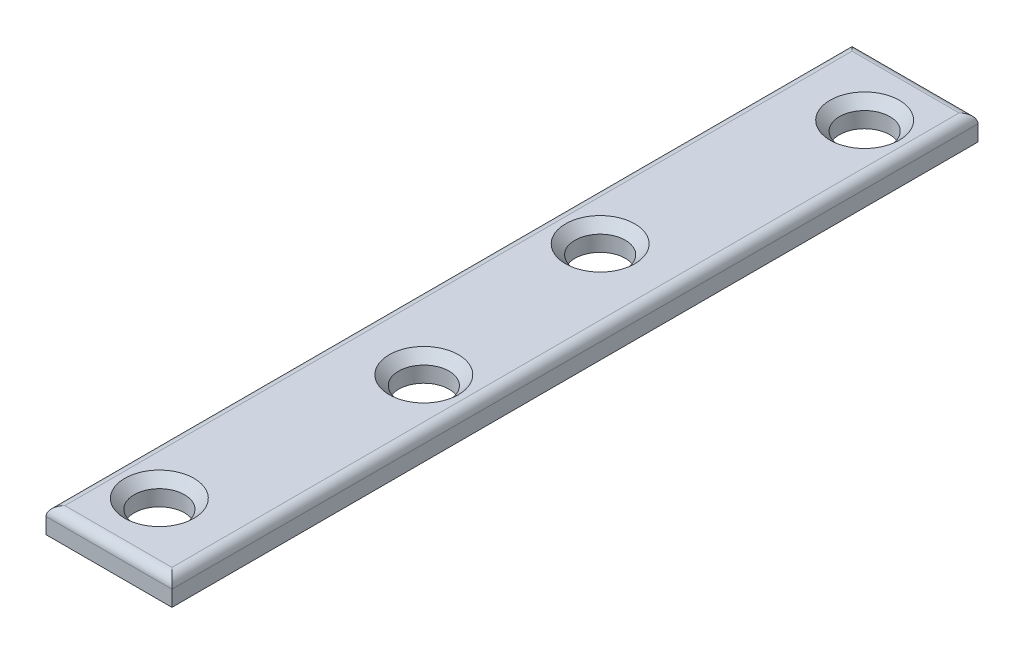
ISO-10303-21;
HEADER;
FILE_DESCRIPTION(('STEP AP214'),'2;1');
FILE_NAME('part.step','',(''),(''),'','','');
FILE_SCHEMA(('AUTOMOTIVE_DESIGN { 1 0 10303 214 1 1 1 1 }'));
ENDSEC;
DATA;
#1=APPLICATION_CONTEXT('core data for automotive mechanical design processes');
#2=APPLICATION_PROTOCOL_DEFINITION('international standard','automotive_design',2000,#1);
#3=PRODUCT_CONTEXT('',#1,'mechanical');
#4=PRODUCT('Part','Part','',(#3));
#5=PRODUCT_RELATED_PRODUCT_CATEGORY('part','',(#4));
#6=PRODUCT_DEFINITION_FORMATION('','',#4);
#7=PRODUCT_DEFINITION_CONTEXT('part definition',#1,'design');
#8=PRODUCT_DEFINITION('design','',#6,#7);
#9=PRODUCT_DEFINITION_SHAPE('','',#8);
#10=(LENGTH_UNIT() NAMED_UNIT(*) SI_UNIT(.MILLI.,.METRE.));
#11=(NAMED_UNIT(*) PLANE_ANGLE_UNIT() SI_UNIT($,.RADIAN.));
#12=(NAMED_UNIT(*) SI_UNIT($,.STERADIAN.) SOLID_ANGLE_UNIT());
#13=UNCERTAINTY_MEASURE_WITH_UNIT(LENGTH_MEASURE(1.E-05),#10,'distance_accuracy_value','');
#14=(GEOMETRIC_REPRESENTATION_CONTEXT(3) GLOBAL_UNCERTAINTY_ASSIGNED_CONTEXT((#13)) GLOBAL_UNIT_ASSIGNED_CONTEXT((#10,
#11,#12)) REPRESENTATION_CONTEXT('',''));
#15=CARTESIAN_POINT('',(0.,0.,0.));
#16=DIRECTION('',(0.,0.,1.));
#17=DIRECTION('',(1.,0.,0.));
#18=AXIS2_PLACEMENT_3D('',#15,#16,#17);
#19=CARTESIAN_POINT('',(0.,3.175,0.));
#20=DIRECTION('',(1.,0.,0.));
#21=DIRECTION('',(0.,0.,-1.));
#22=AXIS2_PLACEMENT_3D('',#19,#20,#21);
#23=PLANE('',#22);
#24=DIRECTION('',(0.,-1.,0.));
#25=VECTOR('',#24,1.);
#26=CARTESIAN_POINT('',(0.,3.175,0.));
#27=LINE('',#26,#25);
#28=CARTESIAN_POINT('',(0.,1.984375,0.));
#29=VERTEX_POINT('',#28);
#30=CARTESIAN_POINT('',(0.,0.,0.));
#31=VERTEX_POINT('',#30);
#32=EDGE_CURVE('E87',#29,#31,#27,.T.);
#33=ORIENTED_EDGE('',*,*,#32,.F.);
#34=DIRECTION('',(0.,0.,1.));
#35=VECTOR('',#34,1.);
#36=CARTESIAN_POINT('',(0.,1.984375,0.));
#37=LINE('',#36,#35);
#38=CARTESIAN_POINT('',(0.,1.984375,-101.6));
#39=VERTEX_POINT('',#38);
#40=EDGE_CURVE('E11',#29,#39,#37,.F.);
#41=ORIENTED_EDGE('',*,*,#40,.T.);
#42=DIRECTION('',(0.,-1.,0.));
#43=VECTOR('',#42,1.);
#44=CARTESIAN_POINT('',(0.,3.175,-101.6));
#45=LINE('',#44,#43);
#46=CARTESIAN_POINT('',(0.,0.,-101.6));
#47=VERTEX_POINT('',#46);
#48=EDGE_CURVE('E107',#39,#47,#45,.T.);
#49=ORIENTED_EDGE('',*,*,#48,.T.);
#50=DIRECTION('',(0.,0.,1.));
#51=VECTOR('',#50,1.);
#52=CARTESIAN_POINT('',(0.,0.,0.));
#53=LINE('',#52,#51);
#54=EDGE_CURVE('E102',#47,#31,#53,.T.);
#55=ORIENTED_EDGE('',*,*,#54,.T.);
#56=EDGE_LOOP('',(#33,#41,#49,#55));
#57=FACE_BOUND('',#56,.T.);
#58=ADVANCED_FACE('F35',(#57),#23,.F.);
#59=CARTESIAN_POINT('',(0.,3.175,0.));
#60=DIRECTION('',(0.,0.,-1.));
#61=DIRECTION('',(-1.,0.,0.));
#62=AXIS2_PLACEMENT_3D('',#59,#60,#61);
#63=PLANE('',#62);
#64=DIRECTION('',(0.,-1.,0.));
#65=VECTOR('',#64,1.);
#66=CARTESIAN_POINT('',(15.875,3.175,0.));
#67=LINE('',#66,#65);
#68=CARTESIAN_POINT('',(15.875,1.984375,0.));
#69=VERTEX_POINT('',#68);
#70=CARTESIAN_POINT('',(15.875,0.,0.));
#71=VERTEX_POINT('',#70);
#72=EDGE_CURVE('E96',#69,#71,#67,.T.);
#73=ORIENTED_EDGE('',*,*,#72,.F.);
#74=DIRECTION('',(1.,0.,0.));
#75=VECTOR('',#74,1.);
#76=CARTESIAN_POINT('',(0.,1.984375,0.));
#77=LINE('',#76,#75);
#78=EDGE_CURVE('E44',#69,#29,#77,.F.);
#79=ORIENTED_EDGE('',*,*,#78,.T.);
#80=ORIENTED_EDGE('',*,*,#32,.T.);
#81=DIRECTION('',(1.,0.,0.));
#82=VECTOR('',#81,1.);
#83=CARTESIAN_POINT('',(0.,0.,0.));
#84=LINE('',#83,#82);
#85=EDGE_CURVE('E90',#31,#71,#84,.T.);
#86=ORIENTED_EDGE('',*,*,#85,.T.);
#87=EDGE_LOOP('',(#73,#79,#80,#86));
#88=FACE_BOUND('',#87,.T.);
#89=ADVANCED_FACE('F89',(#88),#63,.F.);
#90=CARTESIAN_POINT('',(15.875,3.175,0.));
#91=DIRECTION('',(-1.,0.,0.));
#92=DIRECTION('',(0.,0.,1.));
#93=AXIS2_PLACEMENT_3D('',#90,#91,#92);
#94=PLANE('',#93);
#95=DIRECTION('',(0.,-1.,0.));
#96=VECTOR('',#95,1.);
#97=CARTESIAN_POINT('',(15.875,3.175,-101.6));
#98=LINE('',#97,#96);
#99=CARTESIAN_POINT('',(15.875,1.984375,-101.6));
#100=VERTEX_POINT('',#99);
#101=CARTESIAN_POINT('',(15.875,0.,-101.6));
#102=VERTEX_POINT('',#101);
#103=EDGE_CURVE('E120',#100,#102,#98,.T.);
#104=ORIENTED_EDGE('',*,*,#103,.F.);
#105=DIRECTION('',(0.,0.,-1.));
#106=VECTOR('',#105,1.);
#107=CARTESIAN_POINT('',(15.875,1.984375,0.));
#108=LINE('',#107,#106);
#109=EDGE_CURVE('E59',#100,#69,#108,.F.);
#110=ORIENTED_EDGE('',*,*,#109,.T.);
#111=ORIENTED_EDGE('',*,*,#72,.T.);
#112=DIRECTION('',(0.,0.,-1.));
#113=VECTOR('',#112,1.);
#114=CARTESIAN_POINT('',(15.875,0.,0.));
#115=LINE('',#114,#113);
#116=EDGE_CURVE('E104',#71,#102,#115,.T.);
#117=ORIENTED_EDGE('',*,*,#116,.T.);
#118=EDGE_LOOP('',(#104,#110,#111,#117));
#119=FACE_BOUND('',#118,.T.);
#120=ADVANCED_FACE('F205',(#119),#94,.F.);
#121=CARTESIAN_POINT('',(0.,3.175,-101.6));
#122=DIRECTION('',(0.,0.,1.));
#123=DIRECTION('',(1.,0.,0.));
#124=AXIS2_PLACEMENT_3D('',#121,#122,#123);
#125=PLANE('',#124);
#126=ORIENTED_EDGE('',*,*,#48,.F.);
#127=DIRECTION('',(-1.,0.,0.));
#128=VECTOR('',#127,1.);
#129=CARTESIAN_POINT('',(0.,1.984375,-101.6));
#130=LINE('',#129,#128);
#131=EDGE_CURVE('E155',#39,#100,#130,.F.);
#132=ORIENTED_EDGE('',*,*,#131,.T.);
#133=ORIENTED_EDGE('',*,*,#103,.T.);
#134=DIRECTION('',(-1.,0.,0.));
#135=VECTOR('',#134,1.);
#136=CARTESIAN_POINT('',(0.,0.,-101.6));
#137=LINE('',#136,#135);
#138=EDGE_CURVE('E117',#102,#47,#137,.T.);
#139=ORIENTED_EDGE('',*,*,#138,.T.);
#140=EDGE_LOOP('',(#126,#132,#133,#139));
#141=FACE_BOUND('',#140,.T.);
#142=ADVANCED_FACE('F243',(#141),#125,.F.);
#143=CARTESIAN_POINT('',(0.,3.175,0.));
#144=DIRECTION('',(0.,-1.,0.));
#145=DIRECTION('',(0.,0.,-1.));
#146=AXIS2_PLACEMENT_3D('',#143,#144,#145);
#147=PLANE('',#146);
#148=DIRECTION('',(0.,0.,-1.));
#149=VECTOR('',#148,1.);
#150=CARTESIAN_POINT('',(14.684375,3.175,0.));
#151=LINE('',#150,#149);
#152=CARTESIAN_POINT('',(14.684375,3.175,-1.190625));
#153=VERTEX_POINT('',#152);
#154=CARTESIAN_POINT('',(14.684375,3.175,-100.409375));
#155=VERTEX_POINT('',#154);
#156=EDGE_CURVE('E150',#153,#155,#151,.T.);
#157=ORIENTED_EDGE('',*,*,#156,.T.);
#158=DIRECTION('',(-1.,0.,0.));
#159=VECTOR('',#158,1.);
#160=CARTESIAN_POINT('',(0.,3.175,-100.409375));
#161=LINE('',#160,#159);
#162=CARTESIAN_POINT('',(1.190625,3.175,-100.409375));
#163=VERTEX_POINT('',#162);
#164=EDGE_CURVE('E152',#155,#163,#161,.T.);
#165=ORIENTED_EDGE('',*,*,#164,.T.);
#166=DIRECTION('',(0.,0.,1.));
#167=VECTOR('',#166,1.);
#168=CARTESIAN_POINT('',(1.190625,3.175,0.));
#169=LINE('',#168,#167);
#170=CARTESIAN_POINT('',(1.190625,3.175,-1.190625));
#171=VERTEX_POINT('',#170);
#172=EDGE_CURVE('E146',#163,#171,#169,.T.);
#173=ORIENTED_EDGE('',*,*,#172,.T.);
#174=DIRECTION('',(1.,0.,0.));
#175=VECTOR('',#174,1.);
#176=CARTESIAN_POINT('',(0.,3.175,-1.190625));
#177=LINE('',#176,#175);
#178=EDGE_CURVE('E148',#171,#153,#177,.T.);
#179=ORIENTED_EDGE('',*,*,#178,.T.);
#180=EDGE_LOOP('',(#157,#165,#173,#179));
#181=FACE_BOUND('',#180,.T.);
#182=CARTESIAN_POINT('',(6.35,3.175,-7.9375));
#183=DIRECTION('',(0.,-1.,0.));
#184=DIRECTION('',(0.,0.,-1.));
#185=AXIS2_PLACEMENT_3D('',#182,#183,#184);
#186=CIRCLE('',#185,4.365625);
#187=CARTESIAN_POINT('',(6.35,3.175,-12.303125));
#188=VERTEX_POINT('',#187);
#189=EDGE_CURVE('E134',#188,#188,#186,.T.);
#190=ORIENTED_EDGE('',*,*,#189,.T.);
#191=EDGE_LOOP('',(#190));
#192=FACE_BOUND('',#191,.T.);
#193=CARTESIAN_POINT('',(9.525,3.175,-38.1));
#194=DIRECTION('',(0.,-1.,0.));
#195=DIRECTION('',(0.,0.,-1.));
#196=AXIS2_PLACEMENT_3D('',#193,#194,#195);
#197=CIRCLE('',#196,4.365625);
#198=CARTESIAN_POINT('',(9.525,3.175,-42.465625));
#199=VERTEX_POINT('',#198);
#200=EDGE_CURVE('E131',#199,#199,#197,.T.);
#201=ORIENTED_EDGE('',*,*,#200,.T.);
#202=EDGE_LOOP('',(#201));
#203=FACE_BOUND('',#202,.T.);
#204=CARTESIAN_POINT('',(9.525,3.175,-93.6625));
#205=DIRECTION('',(0.,-1.,0.));
#206=DIRECTION('',(0.,0.,-1.));
#207=AXIS2_PLACEMENT_3D('',#204,#205,#206);
#208=CIRCLE('',#207,4.365625);
#209=CARTESIAN_POINT('',(9.525,3.175,-98.028125));
#210=VERTEX_POINT('',#209);
#211=EDGE_CURVE('E128',#210,#210,#208,.T.);
#212=ORIENTED_EDGE('',*,*,#211,.T.);
#213=EDGE_LOOP('',(#212));
#214=FACE_BOUND('',#213,.T.);
#215=CARTESIAN_POINT('',(6.35,3.175,-63.5));
#216=DIRECTION('',(0.,-1.,0.));
#217=DIRECTION('',(0.,0.,-1.));
#218=AXIS2_PLACEMENT_3D('',#215,#216,#217);
#219=CIRCLE('',#218,4.36562499999997);
#220=CARTESIAN_POINT('',(6.35,3.175,-67.865625));
#221=VERTEX_POINT('',#220);
#222=EDGE_CURVE('E125',#221,#221,#219,.T.);
#223=ORIENTED_EDGE('',*,*,#222,.T.);
#224=EDGE_LOOP('',(#223));
#225=FACE_BOUND('',#224,.T.);
#226=ADVANCED_FACE('F247',(#181,#192,#203,#214,#225),#147,.F.);
#227=CARTESIAN_POINT('',(0.,0.,0.));
#228=DIRECTION('',(0.,-1.,0.));
#229=DIRECTION('',(0.,0.,-1.));
#230=AXIS2_PLACEMENT_3D('',#227,#228,#229);
#231=PLANE('',#230);
#232=CARTESIAN_POINT('',(6.35,0.,-7.9375));
#233=DIRECTION('',(0.,1.,0.));
#234=DIRECTION('',(0.,0.,1.));
#235=AXIS2_PLACEMENT_3D('',#232,#233,#234);
#236=CIRCLE('',#235,3.175);
#237=CARTESIAN_POINT('',(6.35,0.,-4.7625));
#238=VERTEX_POINT('',#237);
#239=EDGE_CURVE('E169',#238,#238,#236,.T.);
#240=ORIENTED_EDGE('',*,*,#239,.T.);
#241=EDGE_LOOP('',(#240));
#242=FACE_BOUND('',#241,.T.);
#243=CARTESIAN_POINT('',(9.525,0.,-38.1));
#244=DIRECTION('',(0.,1.,0.));
#245=DIRECTION('',(0.,0.,1.));
#246=AXIS2_PLACEMENT_3D('',#243,#244,#245);
#247=CIRCLE('',#246,3.175);
#248=CARTESIAN_POINT('',(9.525,0.,-34.925));
#249=VERTEX_POINT('',#248);
#250=EDGE_CURVE('E174',#249,#249,#247,.T.);
#251=ORIENTED_EDGE('',*,*,#250,.T.);
#252=EDGE_LOOP('',(#251));
#253=FACE_BOUND('',#252,.T.);
#254=CARTESIAN_POINT('',(9.525,0.,-93.6625));
#255=DIRECTION('',(0.,1.,0.));
#256=DIRECTION('',(0.,0.,1.));
#257=AXIS2_PLACEMENT_3D('',#254,#255,#256);
#258=CIRCLE('',#257,3.175);
#259=CARTESIAN_POINT('',(9.525,0.,-90.4875));
#260=VERTEX_POINT('',#259);
#261=EDGE_CURVE('E112',#260,#260,#258,.T.);
#262=ORIENTED_EDGE('',*,*,#261,.T.);
#263=EDGE_LOOP('',(#262));
#264=FACE_BOUND('',#263,.T.);
#265=CARTESIAN_POINT('',(6.35,0.,-63.5));
#266=DIRECTION('',(0.,1.,0.));
#267=DIRECTION('',(0.,0.,1.));
#268=AXIS2_PLACEMENT_3D('',#265,#266,#267);
#269=CIRCLE('',#268,3.175);
#270=CARTESIAN_POINT('',(6.35,0.,-60.325));
#271=VERTEX_POINT('',#270);
#272=EDGE_CURVE('E109',#271,#271,#269,.T.);
#273=ORIENTED_EDGE('',*,*,#272,.T.);
#274=EDGE_LOOP('',(#273));
#275=FACE_BOUND('',#274,.T.);
#276=ORIENTED_EDGE('',*,*,#54,.F.);
#277=ORIENTED_EDGE('',*,*,#138,.F.);
#278=ORIENTED_EDGE('',*,*,#116,.F.);
#279=ORIENTED_EDGE('',*,*,#85,.F.);
#280=EDGE_LOOP('',(#276,#277,#278,#279));
#281=FACE_BOUND('',#280,.T.);
#282=ADVANCED_FACE('F100',(#242,#253,#264,#275,#281),#231,.T.);
#283=CARTESIAN_POINT('',(6.35,0.,-63.5));
#284=DIRECTION('',(0.,1.,0.));
#285=DIRECTION('',(0.,0.,1.));
#286=AXIS2_PLACEMENT_3D('',#283,#284,#285);
#287=CYLINDRICAL_SURFACE('',#286,3.175);
#288=CARTESIAN_POINT('',(6.35,1.98437500000003,-63.5));
#289=DIRECTION('',(0.,-1.,0.));
#290=DIRECTION('',(0.,0.,-1.));
#291=AXIS2_PLACEMENT_3D('',#288,#289,#290);
#292=CIRCLE('',#291,3.175);
#293=CARTESIAN_POINT('',(6.35,1.98437500000003,-66.675));
#294=VERTEX_POINT('',#293);
#295=EDGE_CURVE('E143',#294,#294,#292,.F.);
#296=ORIENTED_EDGE('',*,*,#295,.T.);
#297=EDGE_LOOP('',(#296));
#298=FACE_BOUND('',#297,.T.);
#299=ORIENTED_EDGE('',*,*,#272,.F.);
#300=EDGE_LOOP('',(#299));
#301=FACE_BOUND('',#300,.T.);
#302=ADVANCED_FACE('F188',(#298,#301),#287,.F.);
#303=CARTESIAN_POINT('',(9.525,0.,-93.6625));
#304=DIRECTION('',(0.,1.,0.));
#305=DIRECTION('',(0.,0.,1.));
#306=AXIS2_PLACEMENT_3D('',#303,#304,#305);
#307=CYLINDRICAL_SURFACE('',#306,3.175);
#308=CARTESIAN_POINT('',(9.525,1.984375,-93.6625));
#309=DIRECTION('',(0.,-1.,0.));
#310=DIRECTION('',(0.,0.,-1.));
#311=AXIS2_PLACEMENT_3D('',#308,#309,#310);
#312=CIRCLE('',#311,3.175);
#313=CARTESIAN_POINT('',(9.525,1.984375,-96.8375));
#314=VERTEX_POINT('',#313);
#315=EDGE_CURVE('E140',#314,#314,#312,.F.);
#316=ORIENTED_EDGE('',*,*,#315,.T.);
#317=EDGE_LOOP('',(#316));
#318=FACE_BOUND('',#317,.T.);
#319=ORIENTED_EDGE('',*,*,#261,.F.);
#320=EDGE_LOOP('',(#319));
#321=FACE_BOUND('',#320,.T.);
#322=ADVANCED_FACE('F185',(#318,#321),#307,.F.);
#323=CARTESIAN_POINT('',(9.525,0.,-38.1));
#324=DIRECTION('',(0.,1.,0.));
#325=DIRECTION('',(0.,0.,1.));
#326=AXIS2_PLACEMENT_3D('',#323,#324,#325);
#327=CYLINDRICAL_SURFACE('',#326,3.175);
#328=CARTESIAN_POINT('',(9.525,1.984375,-38.1));
#329=DIRECTION('',(0.,-1.,0.));
#330=DIRECTION('',(0.,0.,-1.));
#331=AXIS2_PLACEMENT_3D('',#328,#329,#330);
#332=CIRCLE('',#331,3.175);
#333=CARTESIAN_POINT('',(9.525,1.984375,-41.275));
#334=VERTEX_POINT('',#333);
#335=EDGE_CURVE('E137',#334,#334,#332,.F.);
#336=ORIENTED_EDGE('',*,*,#335,.T.);
#337=EDGE_LOOP('',(#336));
#338=FACE_BOUND('',#337,.T.);
#339=ORIENTED_EDGE('',*,*,#250,.F.);
#340=EDGE_LOOP('',(#339));
#341=FACE_BOUND('',#340,.T.);
#342=ADVANCED_FACE('F187',(#338,#341),#327,.F.);
#343=CARTESIAN_POINT('',(6.35,0.,-7.9375));
#344=DIRECTION('',(0.,1.,0.));
#345=DIRECTION('',(0.,0.,1.));
#346=AXIS2_PLACEMENT_3D('',#343,#344,#345);
#347=CYLINDRICAL_SURFACE('',#346,3.175);
#348=CARTESIAN_POINT('',(6.35,1.98437500000001,-7.9375));
#349=DIRECTION('',(0.,-1.,0.));
#350=DIRECTION('',(0.,0.,-1.));
#351=AXIS2_PLACEMENT_3D('',#348,#349,#350);
#352=CIRCLE('',#351,3.175);
#353=CARTESIAN_POINT('',(6.35,1.98437500000001,-11.1125));
#354=VERTEX_POINT('',#353);
#355=EDGE_CURVE('E95',#354,#354,#352,.F.);
#356=ORIENTED_EDGE('',*,*,#355,.T.);
#357=EDGE_LOOP('',(#356));
#358=FACE_BOUND('',#357,.T.);
#359=ORIENTED_EDGE('',*,*,#239,.F.);
#360=EDGE_LOOP('',(#359));
#361=FACE_BOUND('',#360,.T.);
#362=ADVANCED_FACE('F195',(#358,#361),#347,.F.);
#363=CARTESIAN_POINT('',(6.35,1.98437500000001,-7.9375));
#364=DIRECTION('',(0.,1.,0.));
#365=DIRECTION('',(0.,0.,1.));
#366=AXIS2_PLACEMENT_3D('',#363,#364,#365);
#367=CONICAL_SURFACE('',#366,3.175,0.785398163397449);
#368=ORIENTED_EDGE('',*,*,#189,.F.);
#369=EDGE_LOOP('',(#368));
#370=FACE_BOUND('',#369,.T.);
#371=ORIENTED_EDGE('',*,*,#355,.F.);
#372=EDGE_LOOP('',(#371));
#373=FACE_BOUND('',#372,.T.);
#374=ADVANCED_FACE('F209',(#370,#373),#367,.F.);
#375=CARTESIAN_POINT('',(9.525,1.984375,-38.1));
#376=DIRECTION('',(0.,1.,0.));
#377=DIRECTION('',(0.,0.,1.));
#378=AXIS2_PLACEMENT_3D('',#375,#376,#377);
#379=CONICAL_SURFACE('',#378,3.175,0.785398163397452);
#380=ORIENTED_EDGE('',*,*,#200,.F.);
#381=EDGE_LOOP('',(#380));
#382=FACE_BOUND('',#381,.T.);
#383=ORIENTED_EDGE('',*,*,#335,.F.);
#384=EDGE_LOOP('',(#383));
#385=FACE_BOUND('',#384,.T.);
#386=ADVANCED_FACE('F212',(#382,#385),#379,.F.);
#387=CARTESIAN_POINT('',(9.525,1.984375,-93.6625));
#388=DIRECTION('',(0.,1.,0.));
#389=DIRECTION('',(0.,0.,1.));
#390=AXIS2_PLACEMENT_3D('',#387,#388,#389);
#391=CONICAL_SURFACE('',#390,3.175,0.785398163397449);
#392=ORIENTED_EDGE('',*,*,#211,.F.);
#393=EDGE_LOOP('',(#392));
#394=FACE_BOUND('',#393,.T.);
#395=ORIENTED_EDGE('',*,*,#315,.F.);
#396=EDGE_LOOP('',(#395));
#397=FACE_BOUND('',#396,.T.);
#398=ADVANCED_FACE('F216',(#394,#397),#391,.F.);
#399=CARTESIAN_POINT('',(6.35,1.98437500000003,-63.5));
#400=DIRECTION('',(0.,1.,0.));
#401=DIRECTION('',(0.,0.,1.));
#402=AXIS2_PLACEMENT_3D('',#399,#400,#401);
#403=CONICAL_SURFACE('',#402,3.175,0.785398163397449);
#404=ORIENTED_EDGE('',*,*,#222,.F.);
#405=EDGE_LOOP('',(#404));
#406=FACE_BOUND('',#405,.T.);
#407=ORIENTED_EDGE('',*,*,#295,.F.);
#408=EDGE_LOOP('',(#407));
#409=FACE_BOUND('',#408,.T.);
#410=ADVANCED_FACE('F220',(#406,#409),#403,.F.);
#411=CARTESIAN_POINT('',(0.,1.984375,-1.190625));
#412=DIRECTION('',(1.,0.,0.));
#413=DIRECTION('',(0.,0.,-1.));
#414=AXIS2_PLACEMENT_3D('',#411,#412,#413);
#415=CYLINDRICAL_SURFACE('',#414,1.190625);
#416=CARTESIAN_POINT('',(1.190625,1.984375,-1.190625));
#417=DIRECTION('',(0.707106781186547,0.,0.707106781186547));
#418=DIRECTION('',(-0.707106781186547,0.,0.707106781186547));
#419=AXIS2_PLACEMENT_3D('',#416,#417,#418);
#420=ELLIPSE('',#419,1.68379802270047,1.190625);
#421=EDGE_CURVE('E163',#29,#171,#420,.F.);
#422=ORIENTED_EDGE('',*,*,#421,.F.);
#423=ORIENTED_EDGE('',*,*,#78,.F.);
#424=CARTESIAN_POINT('',(14.684375,1.984375,-1.190625));
#425=DIRECTION('',(0.707106781186547,0.,-0.707106781186547));
#426=DIRECTION('',(0.707106781186547,0.,0.707106781186547));
#427=AXIS2_PLACEMENT_3D('',#424,#425,#426);
#428=ELLIPSE('',#427,1.68379802270047,1.190625);
#429=EDGE_CURVE('E39',#153,#69,#428,.T.);
#430=ORIENTED_EDGE('',*,*,#429,.F.);
#431=ORIENTED_EDGE('',*,*,#178,.F.);
#432=EDGE_LOOP('',(#422,#423,#430,#431));
#433=FACE_BOUND('',#432,.T.);
#434=ADVANCED_FACE('F37',(#433),#415,.T.);
#435=CARTESIAN_POINT('',(14.684375,1.984375,0.));
#436=DIRECTION('',(0.,0.,-1.));
#437=DIRECTION('',(-1.,0.,0.));
#438=AXIS2_PLACEMENT_3D('',#435,#436,#437);
#439=CYLINDRICAL_SURFACE('',#438,1.190625);
#440=ORIENTED_EDGE('',*,*,#429,.T.);
#441=ORIENTED_EDGE('',*,*,#109,.F.);
#442=CARTESIAN_POINT('',(14.684375,1.984375,-100.409375));
#443=DIRECTION('',(-0.707106781186547,0.,-0.707106781186547));
#444=DIRECTION('',(0.707106781186547,0.,-0.707106781186547));
#445=AXIS2_PLACEMENT_3D('',#442,#443,#444);
#446=ELLIPSE('',#445,1.68379802270047,1.190625);
#447=EDGE_CURVE('E162',#155,#100,#446,.T.);
#448=ORIENTED_EDGE('',*,*,#447,.F.);
#449=ORIENTED_EDGE('',*,*,#156,.F.);
#450=EDGE_LOOP('',(#440,#441,#448,#449));
#451=FACE_BOUND('',#450,.T.);
#452=ADVANCED_FACE('F231',(#451),#439,.T.);
#453=CARTESIAN_POINT('',(1.190625,1.984375,0.));
#454=DIRECTION('',(0.,0.,1.));
#455=DIRECTION('',(1.,0.,0.));
#456=AXIS2_PLACEMENT_3D('',#453,#454,#455);
#457=CYLINDRICAL_SURFACE('',#456,1.190625);
#458=ORIENTED_EDGE('',*,*,#421,.T.);
#459=ORIENTED_EDGE('',*,*,#172,.F.);
#460=CARTESIAN_POINT('',(1.190625,1.984375,-100.409375));
#461=DIRECTION('',(-0.707106781186547,0.,0.707106781186547));
#462=DIRECTION('',(0.707106781186547,0.,0.707106781186547));
#463=AXIS2_PLACEMENT_3D('',#460,#461,#462);
#464=ELLIPSE('',#463,1.68379802270047,1.190625);
#465=EDGE_CURVE('E160',#39,#163,#464,.F.);
#466=ORIENTED_EDGE('',*,*,#465,.F.);
#467=ORIENTED_EDGE('',*,*,#40,.F.);
#468=EDGE_LOOP('',(#458,#459,#466,#467));
#469=FACE_BOUND('',#468,.T.);
#470=ADVANCED_FACE('F228',(#469),#457,.T.);
#471=CARTESIAN_POINT('',(0.,1.984375,-100.409375));
#472=DIRECTION('',(-1.,0.,0.));
#473=DIRECTION('',(0.,0.,1.));
#474=AXIS2_PLACEMENT_3D('',#471,#472,#473);
#475=CYLINDRICAL_SURFACE('',#474,1.190625);
#476=ORIENTED_EDGE('',*,*,#447,.T.);
#477=ORIENTED_EDGE('',*,*,#131,.F.);
#478=ORIENTED_EDGE('',*,*,#465,.T.);
#479=ORIENTED_EDGE('',*,*,#164,.F.);
#480=EDGE_LOOP('',(#476,#477,#478,#479));
#481=FACE_BOUND('',#480,.T.);
#482=ADVANCED_FACE('F225',(#481),#475,.T.);
#483=CLOSED_SHELL('',(#58,#89,#120,#142,#226,#282,#302,#322,#342,#362,#374,#386,#398,#410,#434,
#452,#470,#482));
#484=MANIFOLD_SOLID_BREP('B2',#483);
#485=ADVANCED_BREP_SHAPE_REPRESENTATION('',(#18,#484),#14);
#486=SHAPE_DEFINITION_REPRESENTATION(#9,#485);
ENDSEC;
END-ISO-10303-21;
